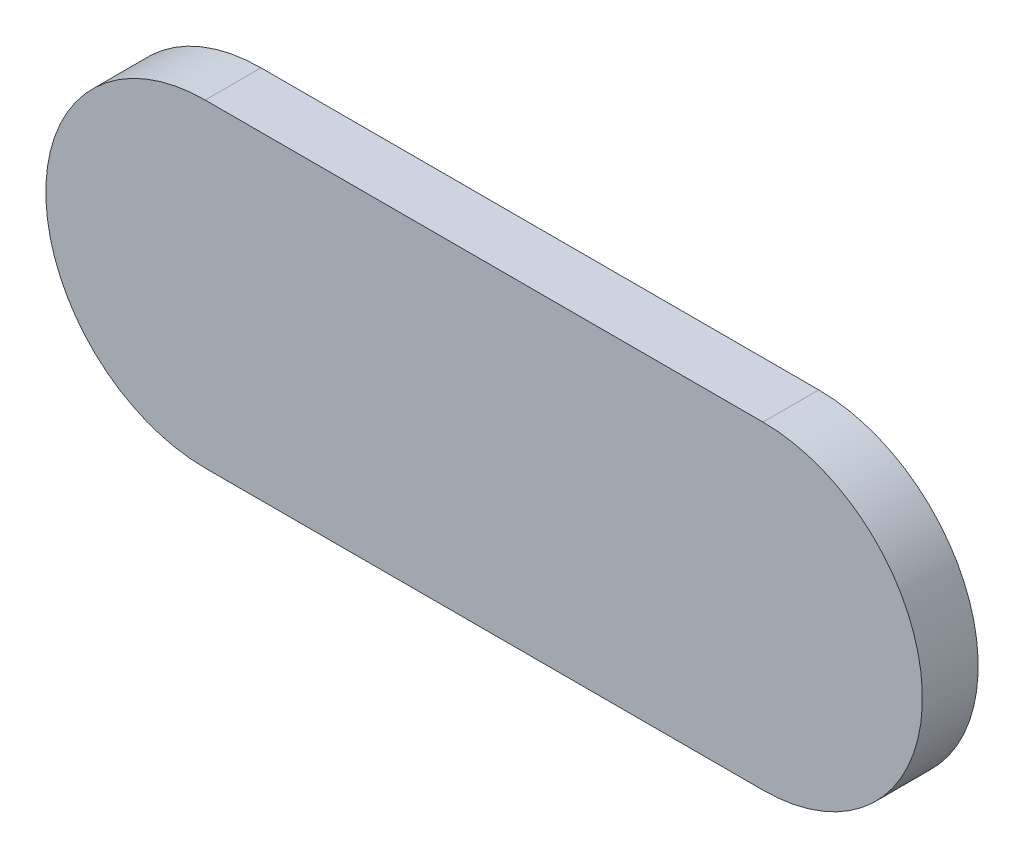
ISO-10303-21;
HEADER;
FILE_DESCRIPTION(('STEP AP214'),'2;1');
FILE_NAME('part.step','',(''),(''),'','','');
FILE_SCHEMA(('AUTOMOTIVE_DESIGN { 1 0 10303 214 1 1 1 1 }'));
ENDSEC;
DATA;
#1=APPLICATION_CONTEXT('core data for automotive mechanical design processes');
#2=APPLICATION_PROTOCOL_DEFINITION('international standard','automotive_design',2000,#1);
#3=PRODUCT_CONTEXT('',#1,'mechanical');
#4=PRODUCT('Part','Part','',(#3));
#5=PRODUCT_RELATED_PRODUCT_CATEGORY('part','',(#4));
#6=PRODUCT_DEFINITION_FORMATION('','',#4);
#7=PRODUCT_DEFINITION_CONTEXT('part definition',#1,'design');
#8=PRODUCT_DEFINITION('design','',#6,#7);
#9=PRODUCT_DEFINITION_SHAPE('','',#8);
#10=(LENGTH_UNIT() NAMED_UNIT(*) SI_UNIT(.MILLI.,.METRE.));
#11=(NAMED_UNIT(*) PLANE_ANGLE_UNIT() SI_UNIT($,.RADIAN.));
#12=(NAMED_UNIT(*) SI_UNIT($,.STERADIAN.) SOLID_ANGLE_UNIT());
#13=UNCERTAINTY_MEASURE_WITH_UNIT(LENGTH_MEASURE(1.E-05),#10,'distance_accuracy_value','');
#14=(GEOMETRIC_REPRESENTATION_CONTEXT(3) GLOBAL_UNCERTAINTY_ASSIGNED_CONTEXT((#13)) GLOBAL_UNIT_ASSIGNED_CONTEXT((#10,
#11,#12)) REPRESENTATION_CONTEXT('',''));
#15=CARTESIAN_POINT('',(0.,0.,0.));
#16=DIRECTION('',(0.,0.,1.));
#17=DIRECTION('',(1.,0.,0.));
#18=AXIS2_PLACEMENT_3D('',#15,#16,#17);
#19=CARTESIAN_POINT('',(82.95,-117.25,1.635));
#20=DIRECTION('',(0.,0.,1.));
#21=DIRECTION('',(1.,0.,0.));
#22=AXIS2_PLACEMENT_3D('',#19,#20,#21);
#23=PLANE('',#22);
#24=DIRECTION('',(-1.,0.,0.));
#25=VECTOR('',#24,1.);
#26=CARTESIAN_POINT('',(82.95,-117.25,1.635));
#27=LINE('',#26,#25);
#28=CARTESIAN_POINT('',(82.95,-117.25,1.635));
#29=VERTEX_POINT('',#28);
#30=CARTESIAN_POINT('',(82.6,-117.25,1.635));
#31=VERTEX_POINT('',#30);
#32=EDGE_CURVE('E84',#29,#31,#27,.T.);
#33=ORIENTED_EDGE('',*,*,#32,.T.);
#34=CARTESIAN_POINT('',(82.6,-117.35,1.635));
#35=DIRECTION('',(0.,0.,1.));
#36=DIRECTION('',(-1.42108547152E-13,1.,0.));
#37=AXIS2_PLACEMENT_3D('',#34,#35,#36);
#38=CIRCLE('',#37,0.1);
#39=CARTESIAN_POINT('',(82.6,-117.45,1.635));
#40=VERTEX_POINT('',#39);
#41=EDGE_CURVE('E70',#31,#40,#38,.T.);
#42=ORIENTED_EDGE('',*,*,#41,.T.);
#43=DIRECTION('',(1.,0.,0.));
#44=VECTOR('',#43,1.);
#45=CARTESIAN_POINT('',(82.6,-117.45,1.635));
#46=LINE('',#45,#44);
#47=CARTESIAN_POINT('',(82.95,-117.45,1.635));
#48=VERTEX_POINT('',#47);
#49=EDGE_CURVE('E101',#40,#48,#46,.T.);
#50=ORIENTED_EDGE('',*,*,#49,.T.);
#51=CARTESIAN_POINT('',(82.95,-117.35,1.635));
#52=DIRECTION('',(0.,0.,1.));
#53=DIRECTION('',(1.42108547152E-13,-1.,0.));
#54=AXIS2_PLACEMENT_3D('',#51,#52,#53);
#55=CIRCLE('',#54,0.1);
#56=EDGE_CURVE('E11',#48,#29,#55,.T.);
#57=ORIENTED_EDGE('',*,*,#56,.T.);
#58=EDGE_LOOP('',(#33,#42,#50,#57));
#59=FACE_BOUND('',#58,.T.);
#60=ADVANCED_FACE('F17',(#59),#23,.T.);
#61=CARTESIAN_POINT('',(82.95,-117.25,1.6));
#62=DIRECTION('',(0.,0.,1.));
#63=DIRECTION('',(1.,0.,0.));
#64=AXIS2_PLACEMENT_3D('',#61,#62,#63);
#65=PLANE('',#64);
#66=CARTESIAN_POINT('',(82.95,-117.35,1.6));
#67=DIRECTION('',(0.,0.,1.));
#68=DIRECTION('',(1.42108547152E-13,-1.,0.));
#69=AXIS2_PLACEMENT_3D('',#66,#67,#68);
#70=CIRCLE('',#69,0.1);
#71=CARTESIAN_POINT('',(82.95,-117.45,1.6));
#72=VERTEX_POINT('',#71);
#73=CARTESIAN_POINT('',(82.95,-117.25,1.6));
#74=VERTEX_POINT('',#73);
#75=EDGE_CURVE('E25',#72,#74,#70,.T.);
#76=ORIENTED_EDGE('',*,*,#75,.F.);
#77=DIRECTION('',(1.,0.,0.));
#78=VECTOR('',#77,1.);
#79=CARTESIAN_POINT('',(82.6,-117.45,1.6));
#80=LINE('',#79,#78);
#81=CARTESIAN_POINT('',(82.6,-117.45,1.6));
#82=VERTEX_POINT('',#81);
#83=EDGE_CURVE('E81',#82,#72,#80,.T.);
#84=ORIENTED_EDGE('',*,*,#83,.F.);
#85=CARTESIAN_POINT('',(82.6,-117.35,1.6));
#86=DIRECTION('',(0.,0.,1.));
#87=DIRECTION('',(-1.42108547152E-13,1.,0.));
#88=AXIS2_PLACEMENT_3D('',#85,#86,#87);
#89=CIRCLE('',#88,0.1);
#90=CARTESIAN_POINT('',(82.6,-117.25,1.6));
#91=VERTEX_POINT('',#90);
#92=EDGE_CURVE('E108',#91,#82,#89,.T.);
#93=ORIENTED_EDGE('',*,*,#92,.F.);
#94=DIRECTION('',(-1.,0.,0.));
#95=VECTOR('',#94,1.);
#96=CARTESIAN_POINT('',(82.95,-117.25,1.6));
#97=LINE('',#96,#95);
#98=EDGE_CURVE('E91',#74,#91,#97,.T.);
#99=ORIENTED_EDGE('',*,*,#98,.F.);
#100=EDGE_LOOP('',(#76,#84,#93,#99));
#101=FACE_BOUND('',#100,.T.);
#102=ADVANCED_FACE('F125',(#101),#65,.F.);
#103=CARTESIAN_POINT('',(82.95,-117.35,1.6));
#104=DIRECTION('',(0.,0.,-1.));
#105=DIRECTION('',(1.42108547152E-13,-1.,0.));
#106=AXIS2_PLACEMENT_3D('',#103,#104,#105);
#107=CYLINDRICAL_SURFACE('',#106,0.1);
#108=ORIENTED_EDGE('',*,*,#75,.T.);
#109=DIRECTION('',(0.,0.,1.));
#110=VECTOR('',#109,1.);
#111=CARTESIAN_POINT('',(82.95,-117.25,1.6));
#112=LINE('',#111,#110);
#113=EDGE_CURVE('E88',#74,#29,#112,.T.);
#114=ORIENTED_EDGE('',*,*,#113,.T.);
#115=ORIENTED_EDGE('',*,*,#56,.F.);
#116=DIRECTION('',(0.,0.,1.));
#117=VECTOR('',#116,1.);
#118=CARTESIAN_POINT('',(82.95,-117.45,1.6));
#119=LINE('',#118,#117);
#120=EDGE_CURVE('E102',#72,#48,#119,.T.);
#121=ORIENTED_EDGE('',*,*,#120,.F.);
#122=EDGE_LOOP('',(#108,#114,#115,#121));
#123=FACE_BOUND('',#122,.T.);
#124=ADVANCED_FACE('F123',(#123),#107,.T.);
#125=CARTESIAN_POINT('',(82.6,-117.45,1.6));
#126=DIRECTION('',(0.,1.,0.));
#127=DIRECTION('',(1.,0.,0.));
#128=AXIS2_PLACEMENT_3D('',#125,#126,#127);
#129=PLANE('',#128);
#130=ORIENTED_EDGE('',*,*,#83,.T.);
#131=ORIENTED_EDGE('',*,*,#120,.T.);
#132=ORIENTED_EDGE('',*,*,#49,.F.);
#133=DIRECTION('',(0.,0.,1.));
#134=VECTOR('',#133,1.);
#135=CARTESIAN_POINT('',(82.6,-117.45,1.6));
#136=LINE('',#135,#134);
#137=EDGE_CURVE('E78',#82,#40,#136,.T.);
#138=ORIENTED_EDGE('',*,*,#137,.F.);
#139=EDGE_LOOP('',(#130,#131,#132,#138));
#140=FACE_BOUND('',#139,.T.);
#141=ADVANCED_FACE('F122',(#140),#129,.F.);
#142=CARTESIAN_POINT('',(82.6,-117.35,1.6));
#143=DIRECTION('',(0.,0.,-1.));
#144=DIRECTION('',(-1.42108547152E-13,1.,0.));
#145=AXIS2_PLACEMENT_3D('',#142,#143,#144);
#146=CYLINDRICAL_SURFACE('',#145,0.1);
#147=ORIENTED_EDGE('',*,*,#92,.T.);
#148=ORIENTED_EDGE('',*,*,#137,.T.);
#149=ORIENTED_EDGE('',*,*,#41,.F.);
#150=DIRECTION('',(0.,0.,1.));
#151=VECTOR('',#150,1.);
#152=CARTESIAN_POINT('',(82.6,-117.25,1.6));
#153=LINE('',#152,#151);
#154=EDGE_CURVE('E75',#91,#31,#153,.T.);
#155=ORIENTED_EDGE('',*,*,#154,.F.);
#156=EDGE_LOOP('',(#147,#148,#149,#155));
#157=FACE_BOUND('',#156,.T.);
#158=ADVANCED_FACE('F73',(#157),#146,.T.);
#159=CARTESIAN_POINT('',(82.95,-117.25,1.6));
#160=DIRECTION('',(0.,-1.,0.));
#161=DIRECTION('',(0.,0.,-1.));
#162=AXIS2_PLACEMENT_3D('',#159,#160,#161);
#163=PLANE('',#162);
#164=ORIENTED_EDGE('',*,*,#98,.T.);
#165=ORIENTED_EDGE('',*,*,#154,.T.);
#166=ORIENTED_EDGE('',*,*,#32,.F.);
#167=ORIENTED_EDGE('',*,*,#113,.F.);
#168=EDGE_LOOP('',(#164,#165,#166,#167));
#169=FACE_BOUND('',#168,.T.);
#170=ADVANCED_FACE('F90',(#169),#163,.F.);
#171=CLOSED_SHELL('',(#60,#102,#124,#141,#158,#170));
#172=MANIFOLD_SOLID_BREP('B1',#171);
#173=ADVANCED_BREP_SHAPE_REPRESENTATION('',(#18,#172),#14);
#174=SHAPE_DEFINITION_REPRESENTATION(#9,#173);
ENDSEC;
END-ISO-10303-21;
